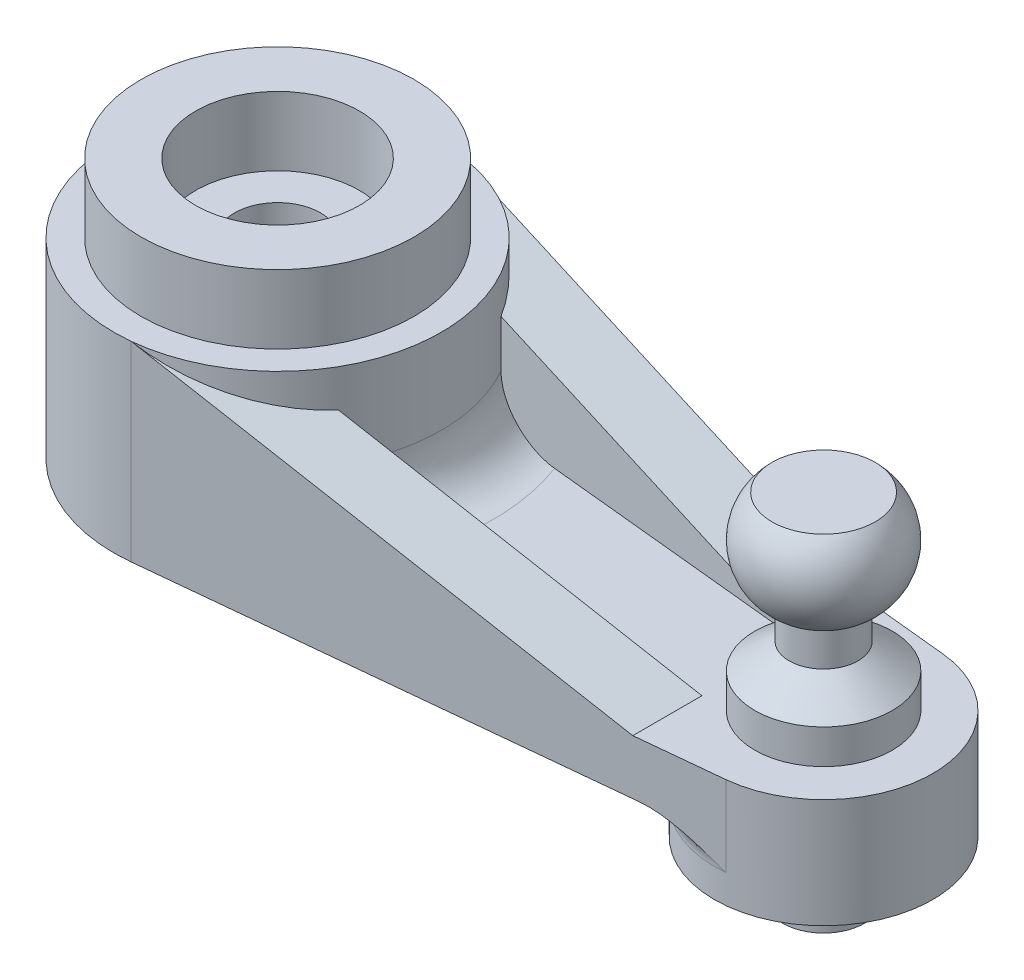
ISO-10303-21;
HEADER;
FILE_DESCRIPTION(('STEP AP214'),'2;1');
FILE_NAME('part.step','',(''),(''),'','','');
FILE_SCHEMA(('AUTOMOTIVE_DESIGN { 1 0 10303 214 1 1 1 1 }'));
ENDSEC;
DATA;
#1=APPLICATION_CONTEXT('core data for automotive mechanical design processes');
#2=APPLICATION_PROTOCOL_DEFINITION('international standard','automotive_design',2000,#1);
#3=PRODUCT_CONTEXT('',#1,'mechanical');
#4=PRODUCT('Part','Part','',(#3));
#5=PRODUCT_RELATED_PRODUCT_CATEGORY('part','',(#4));
#6=PRODUCT_DEFINITION_FORMATION('','',#4);
#7=PRODUCT_DEFINITION_CONTEXT('part definition',#1,'design');
#8=PRODUCT_DEFINITION('design','',#6,#7);
#9=PRODUCT_DEFINITION_SHAPE('','',#8);
#10=(LENGTH_UNIT() NAMED_UNIT(*) SI_UNIT(.MILLI.,.METRE.));
#11=(NAMED_UNIT(*) PLANE_ANGLE_UNIT() SI_UNIT($,.RADIAN.));
#12=(NAMED_UNIT(*) SI_UNIT($,.STERADIAN.) SOLID_ANGLE_UNIT());
#13=UNCERTAINTY_MEASURE_WITH_UNIT(LENGTH_MEASURE(1.E-05),#10,'distance_accuracy_value','');
#14=(GEOMETRIC_REPRESENTATION_CONTEXT(3) GLOBAL_UNCERTAINTY_ASSIGNED_CONTEXT((#13)) GLOBAL_UNIT_ASSIGNED_CONTEXT((#10,
#11,#12)) REPRESENTATION_CONTEXT('',''));
#15=CARTESIAN_POINT('',(0.,0.,0.));
#16=DIRECTION('',(0.,0.,1.));
#17=DIRECTION('',(1.,0.,0.));
#18=AXIS2_PLACEMENT_3D('',#15,#16,#17);
#19=CARTESIAN_POINT('',(1.56570147232496,5.23010843007844,-4.7625));
#20=DIRECTION('',(-0.286788069038324,-0.957994051890339,0.));
#21=DIRECTION('',(0.957994051890339,-0.286788069038324,0.));
#22=AXIS2_PLACEMENT_3D('',#19,#20,#21);
#23=PLANE('',#22);
#24=DIRECTION('',(-0.953584276240566,0.285467944930043,-0.0958388257658354));
#25=VECTOR('',#24,1.);
#26=CARTESIAN_POINT('',(1.36981146054647,5.28875067123953,-2.63874573289111));
#27=LINE('',#26,#25);
#28=CARTESIAN_POINT('',(13.7335619453296,1.5875,-1.39614205532746));
#29=VERTEX_POINT('',#28);
#30=CARTESIAN_POINT('',(4.13623704661039,4.46058493221435,-2.36070950018162));
#31=VERTEX_POINT('',#30);
#32=EDGE_CURVE('E127',#29,#31,#27,.T.);
#33=ORIENTED_EDGE('',*,*,#32,.F.);
#34=DIRECTION('',(0.,0.,1.));
#35=VECTOR('',#34,1.);
#36=CARTESIAN_POINT('',(13.7335619453296,1.5875,-4.7625));
#37=LINE('',#36,#35);
#38=CARTESIAN_POINT('',(13.7335619453296,1.5875,-3.40621768584589));
#39=VERTEX_POINT('',#38);
#40=EDGE_CURVE('E143',#39,#29,#37,.T.);
#41=ORIENTED_EDGE('',*,*,#40,.F.);
#42=DIRECTION('',(0.953584276240566,-0.285467944930043,0.0958388257658355));
#43=VECTOR('',#42,1.);
#44=CARTESIAN_POINT('',(0.47625,5.55625,-4.73862766922028));
#45=LINE('',#44,#43);
#46=CARTESIAN_POINT('',(0.47625,5.55625,-4.73862766922028));
#47=VERTEX_POINT('',#46);
#48=EDGE_CURVE('E147',#47,#39,#45,.T.);
#49=ORIENTED_EDGE('',*,*,#48,.F.);
#50=CARTESIAN_POINT('',(0.,5.69882167631677,0.));
#51=DIRECTION('',(-0.286788069038324,-0.957994051890339,0.));
#52=DIRECTION('',(-0.957994051890339,0.286788069038324,0.));
#53=AXIS2_PLACEMENT_3D('',#50,#51,#52);
#54=ELLIPSE('',#53,4.97132522963218,4.7625);
#55=EDGE_CURVE('E185',#47,#31,#54,.T.);
#56=ORIENTED_EDGE('',*,*,#55,.T.);
#57=EDGE_LOOP('',(#33,#41,#49,#56));
#58=FACE_BOUND('',#57,.T.);
#59=ADVANCED_FACE('F39',(#58),#23,.F.);
#60=CARTESIAN_POINT('',(0.,5.55625,0.));
#61=DIRECTION('',(0.,-1.,0.));
#62=DIRECTION('',(0.,0.,-1.));
#63=AXIS2_PLACEMENT_3D('',#60,#61,#62);
#64=CYLINDRICAL_SURFACE('',#63,4.7625);
#65=CARTESIAN_POINT('',(0.,0.,0.));
#66=DIRECTION('',(0.,1.,0.));
#67=DIRECTION('',(0.,0.,1.));
#68=AXIS2_PLACEMENT_3D('',#65,#66,#67);
#69=CIRCLE('',#68,4.7625);
#70=CARTESIAN_POINT('',(0.47625,0.,-4.73862766922028));
#71=VERTEX_POINT('',#70);
#72=CARTESIAN_POINT('',(0.476250000000001,0.,4.73862766922028));
#73=VERTEX_POINT('',#72);
#74=EDGE_CURVE('E160',#71,#73,#69,.T.);
#75=ORIENTED_EDGE('',*,*,#74,.T.);
#76=DIRECTION('',(0.,-1.,0.));
#77=VECTOR('',#76,1.);
#78=CARTESIAN_POINT('',(0.476250000000001,5.55625,4.73862766922028));
#79=LINE('',#78,#77);
#80=CARTESIAN_POINT('',(0.476249999999999,5.55625,4.73862766922028));
#81=VERTEX_POINT('',#80);
#82=EDGE_CURVE('E178',#81,#73,#79,.T.);
#83=ORIENTED_EDGE('',*,*,#82,.F.);
#84=CARTESIAN_POINT('',(0.,5.55625,0.));
#85=DIRECTION('',(0.,1.,0.));
#86=DIRECTION('',(0.,0.,1.));
#87=AXIS2_PLACEMENT_3D('',#84,#85,#86);
#88=CIRCLE('',#87,4.7625);
#89=EDGE_CURVE('E161',#47,#81,#88,.T.);
#90=ORIENTED_EDGE('',*,*,#89,.F.);
#91=DIRECTION('',(0.,-1.,0.));
#92=VECTOR('',#91,1.);
#93=CARTESIAN_POINT('',(0.47625,5.55625,-4.73862766922028));
#94=LINE('',#93,#92);
#95=EDGE_CURVE('E164',#47,#71,#94,.T.);
#96=ORIENTED_EDGE('',*,*,#95,.T.);
#97=EDGE_LOOP('',(#75,#83,#90,#96));
#98=FACE_BOUND('',#97,.T.);
#99=ADVANCED_FACE('F226',(#98),#64,.T.);
#100=CARTESIAN_POINT('',(0.47625,5.55625,4.73862766922028));
#101=DIRECTION('',(-0.1,0.,-0.99498743710662));
#102=DIRECTION('',(-0.99498743710662,0.,0.1));
#103=AXIS2_PLACEMENT_3D('',#100,#101,#102);
#104=PLANE('',#103);
#105=DIRECTION('',(0.,-1.,0.));
#106=VECTOR('',#105,1.);
#107=CARTESIAN_POINT('',(16.1925,5.55625,3.15908511281352));
#108=LINE('',#107,#106);
#109=CARTESIAN_POINT('',(16.1925,1.5875,3.15908511281352));
#110=VERTEX_POINT('',#109);
#111=CARTESIAN_POINT('',(16.1925,-0.75,3.15908511281352));
#112=VERTEX_POINT('',#111);
#113=EDGE_CURVE('E176',#110,#112,#108,.T.);
#114=ORIENTED_EDGE('',*,*,#113,.F.);
#115=DIRECTION('',(-0.99498743710662,0.,0.1));
#116=VECTOR('',#115,1.);
#117=CARTESIAN_POINT('',(0.47625,1.5875,4.73862766922028));
#118=LINE('',#117,#116);
#119=CARTESIAN_POINT('',(13.7335619453296,1.5875,3.40621768584588));
#120=VERTEX_POINT('',#119);
#121=EDGE_CURVE('E158',#110,#120,#118,.T.);
#122=ORIENTED_EDGE('',*,*,#121,.T.);
#123=DIRECTION('',(-0.953584276240566,0.285467944930043,0.0958388257658356));
#124=VECTOR('',#123,1.);
#125=CARTESIAN_POINT('',(0.47625,5.55625,4.73862766922028));
#126=LINE('',#125,#124);
#127=EDGE_CURVE('E141',#120,#81,#126,.T.);
#128=ORIENTED_EDGE('',*,*,#127,.T.);
#129=ORIENTED_EDGE('',*,*,#82,.T.);
#130=DIRECTION('',(0.99498743710662,0.,-0.1));
#131=VECTOR('',#130,1.);
#132=CARTESIAN_POINT('',(0.47625,0.,4.73862766922028));
#133=LINE('',#132,#131);
#134=CARTESIAN_POINT('',(13.8964708190008,0.,3.3898447279978));
#135=VERTEX_POINT('',#134);
#136=EDGE_CURVE('E168',#73,#135,#133,.T.);
#137=ORIENTED_EDGE('',*,*,#136,.T.);
#138=CARTESIAN_POINT('',(13.8964708190008,0.,3.38984472799781));
#139=CARTESIAN_POINT('',(13.9375612790772,-3.94246342919245E-06,3.38571498137548));
#140=CARTESIAN_POINT('',(13.9786355181918,-0.00117843439605369,3.38158686502116));
#141=CARTESIAN_POINT('',(14.06064768221,-0.00564932245312722,3.37334433240622));
#142=CARTESIAN_POINT('',(14.1015856718321,-0.00894450004539813,3.36922990964113));
#143=CARTESIAN_POINT('',(14.2238604204602,-0.0216588612066211,3.35694083501886));
#144=CARTESIAN_POINT('',(14.3049103008642,-0.033909604156082,3.34879501554605));
#145=CARTESIAN_POINT('',(14.4648125016523,-0.0643380609874803,3.33272423969252));
#146=CARTESIAN_POINT('',(14.5436796096108,-0.0824403947750877,3.32479779710467));
#147=CARTESIAN_POINT('',(14.7002091092547,-0.123492221473624,3.3090659904701));
#148=CARTESIAN_POINT('',(14.7778704104938,-0.146445855394132,3.30126073601735));
#149=CARTESIAN_POINT('',(14.9694386881453,-0.20833819157437,3.28200739969297));
#150=CARTESIAN_POINT('',(15.0825897955947,-0.249619564983325,3.27063528551045));
#151=CARTESIAN_POINT('',(15.3065260020936,-0.338110614607334,3.24812884993675));
#152=CARTESIAN_POINT('',(15.417310925066,-0.385320730217228,3.23699454624197));
#153=CARTESIAN_POINT('',(15.74794092754,-0.532924312454419,3.20376498070739));
#154=CARTESIAN_POINT('',(15.9652316447195,-0.638986598261524,3.18192644194034));
#155=CARTESIAN_POINT('',(16.1857767480147,-0.746715882989358,3.1597608250622));
#156=CARTESIAN_POINT('',(16.1891383807568,-0.748357952442116,3.15942296825951));
#157=CARTESIAN_POINT('',(16.1925,-0.75,3.15908511281352));
#158=B_SPLINE_CURVE_WITH_KNOTS('',3,(#138,#139,#140,#141,#142,#143,#144,#145,#146,#147,#148,
#149,#150,#151,#152,#153,#154,#155,#156,#157),.UNSPECIFIED.,.F.,.F.,(4,2,2,2,2,2,2,2,2,4),(0.,
0.123850203641415,0.247629307221144,0.494429882293765,0.738170051786999,0.982119121254398,
1.34480112618795,1.70751002632931,2.43558313806341,2.4468525657335),.UNSPECIFIED.);
#159=EDGE_CURVE('E202',#135,#112,#158,.T.);
#160=ORIENTED_EDGE('',*,*,#159,.T.);
#161=EDGE_LOOP('',(#114,#122,#128,#129,#137,#160));
#162=FACE_BOUND('',#161,.T.);
#163=ADVANCED_FACE('F222',(#162),#104,.F.);
#164=CARTESIAN_POINT('',(15.875,5.55625,0.));
#165=DIRECTION('',(0.,-1.,0.));
#166=DIRECTION('',(0.,0.,-1.));
#167=AXIS2_PLACEMENT_3D('',#164,#165,#166);
#168=CYLINDRICAL_SURFACE('',#167,3.175);
#169=CARTESIAN_POINT('',(15.875,-0.75,0.));
#170=DIRECTION('',(0.,1.,0.));
#171=DIRECTION('',(0.,0.,1.));
#172=AXIS2_PLACEMENT_3D('',#169,#170,#171);
#173=CIRCLE('',#172,3.175);
#174=CARTESIAN_POINT('',(16.1925,-0.75,-3.15908511281352));
#175=VERTEX_POINT('',#174);
#176=EDGE_CURVE('E191',#112,#175,#173,.F.);
#177=ORIENTED_EDGE('',*,*,#176,.T.);
#178=DIRECTION('',(0.,-1.,0.));
#179=VECTOR('',#178,1.);
#180=CARTESIAN_POINT('',(16.1925,5.55625,-3.15908511281352));
#181=LINE('',#180,#179);
#182=CARTESIAN_POINT('',(16.1925,1.5875,-3.15908511281352));
#183=VERTEX_POINT('',#182);
#184=EDGE_CURVE('E174',#183,#175,#181,.T.);
#185=ORIENTED_EDGE('',*,*,#184,.F.);
#186=CARTESIAN_POINT('',(15.875,1.5875,0.));
#187=DIRECTION('',(0.,-1.,0.));
#188=DIRECTION('',(1.,0.,0.));
#189=AXIS2_PLACEMENT_3D('',#186,#187,#188);
#190=CIRCLE('',#189,3.175);
#191=EDGE_CURVE('E155',#183,#110,#190,.T.);
#192=ORIENTED_EDGE('',*,*,#191,.T.);
#193=ORIENTED_EDGE('',*,*,#113,.T.);
#194=EDGE_LOOP('',(#177,#185,#192,#193));
#195=FACE_BOUND('',#194,.T.);
#196=CARTESIAN_POINT('',(15.875,-1.5875,0.));
#197=DIRECTION('',(0.,-1.,0.));
#198=DIRECTION('',(0.,0.,-1.));
#199=AXIS2_PLACEMENT_3D('',#196,#197,#198);
#200=CIRCLE('',#199,3.175);
#201=CARTESIAN_POINT('',(15.875,-1.5875,-3.175));
#202=VERTEX_POINT('',#201);
#203=EDGE_CURVE('E315',#202,#202,#200,.T.);
#204=ORIENTED_EDGE('',*,*,#203,.F.);
#205=EDGE_LOOP('',(#204));
#206=FACE_BOUND('',#205,.T.);
#207=ADVANCED_FACE('F217',(#195,#206),#168,.T.);
#208=CARTESIAN_POINT('',(0.47625,5.55625,-4.73862766922028));
#209=DIRECTION('',(-0.1,0.,0.99498743710662));
#210=DIRECTION('',(0.99498743710662,0.,0.1));
#211=AXIS2_PLACEMENT_3D('',#208,#209,#210);
#212=PLANE('',#211);
#213=ORIENTED_EDGE('',*,*,#48,.T.);
#214=DIRECTION('',(0.99498743710662,0.,0.1));
#215=VECTOR('',#214,1.);
#216=CARTESIAN_POINT('',(0.476249999999999,1.5875,-4.73862766922028));
#217=LINE('',#216,#215);
#218=EDGE_CURVE('E181',#39,#183,#217,.T.);
#219=ORIENTED_EDGE('',*,*,#218,.T.);
#220=ORIENTED_EDGE('',*,*,#184,.T.);
#221=CARTESIAN_POINT('',(13.8964708190008,0.,-3.38984472799781));
#222=CARTESIAN_POINT('',(13.9375612790772,-3.94246342919346E-06,-3.38571498137548));
#223=CARTESIAN_POINT('',(13.9786355181919,-0.00117843439605533,-3.38158686502116));
#224=CARTESIAN_POINT('',(14.0606476822101,-0.00564932245313488,-3.3733443324062));
#225=CARTESIAN_POINT('',(14.1015856718322,-0.00894450004541014,-3.36922990964111));
#226=CARTESIAN_POINT('',(14.2238604204605,-0.0216588612066482,-3.35694083501884));
#227=CARTESIAN_POINT('',(14.3049103008644,-0.0339096041561221,-3.34879501554602));
#228=CARTESIAN_POINT('',(14.4648125016526,-0.0643380609875347,-3.33272423969249));
#229=CARTESIAN_POINT('',(14.543679609611,-0.082440394775136,-3.32479779710466));
#230=CARTESIAN_POINT('',(14.7002091092548,-0.123492221473648,-3.3090659904701));
#231=CARTESIAN_POINT('',(14.7778704104939,-0.146445855394138,-3.30126073601734));
#232=CARTESIAN_POINT('',(14.9694386881452,-0.208338191574376,-3.28200739969297));
#233=CARTESIAN_POINT('',(15.0825897955947,-0.249619564983366,-3.27063528551046));
#234=CARTESIAN_POINT('',(15.3065260020936,-0.338110614607269,-3.24812884993675));
#235=CARTESIAN_POINT('',(15.417310925066,-0.385320730217023,-3.23699454624197));
#236=CARTESIAN_POINT('',(15.7479409275398,-0.532924312454753,-3.20376498070741));
#237=CARTESIAN_POINT('',(15.9652316447185,-0.638986598263485,-3.18192644194042));
#238=CARTESIAN_POINT('',(16.1857767480146,-0.746715882989417,-3.1597608250622));
#239=CARTESIAN_POINT('',(16.1891383807568,-0.748357952442146,-3.15942296825951));
#240=CARTESIAN_POINT('',(16.1925,-0.75,-3.15908511281352));
#241=B_SPLINE_CURVE_WITH_KNOTS('',3,(#221,#222,#223,#224,#225,#226,#227,#228,#229,#230,#231,
#232,#233,#234,#235,#236,#237,#238,#239,#240),.UNSPECIFIED.,.F.,.F.,(4,2,2,2,2,2,2,2,2,4),(0.,
0.123850203641501,0.247629307221314,0.494429882294068,0.738170051787138,0.982119121254391,
1.34480112618792,1.70751002632922,2.4355831380634,2.4468525657335),.UNSPECIFIED.);
#242=CARTESIAN_POINT('',(13.8964708190008,0.,-3.3898447279978));
#243=VERTEX_POINT('',#242);
#244=EDGE_CURVE('E196',#175,#243,#241,.F.);
#245=ORIENTED_EDGE('',*,*,#244,.T.);
#246=DIRECTION('',(-0.99498743710662,0.,-0.1));
#247=VECTOR('',#246,1.);
#248=CARTESIAN_POINT('',(0.47625,0.,-4.73862766922028));
#249=LINE('',#248,#247);
#250=EDGE_CURVE('E165',#243,#71,#249,.T.);
#251=ORIENTED_EDGE('',*,*,#250,.T.);
#252=ORIENTED_EDGE('',*,*,#95,.F.);
#253=EDGE_LOOP('',(#213,#219,#220,#245,#251,#252));
#254=FACE_BOUND('',#253,.T.);
#255=ADVANCED_FACE('F211',(#254),#212,.F.);
#256=CARTESIAN_POINT('',(0.,5.55625,0.));
#257=DIRECTION('',(0.,1.,0.));
#258=DIRECTION('',(0.,0.,1.));
#259=AXIS2_PLACEMENT_3D('',#256,#257,#258);
#260=PLANE('',#259);
#261=CARTESIAN_POINT('',(0.,5.55625,0.));
#262=DIRECTION('',(0.,1.,0.));
#263=DIRECTION('',(0.,0.,1.));
#264=AXIS2_PLACEMENT_3D('',#261,#262,#263);
#265=CIRCLE('',#264,3.96875);
#266=CARTESIAN_POINT('',(0.,5.55625,3.96875));
#267=VERTEX_POINT('',#266);
#268=EDGE_CURVE('E329',#267,#267,#265,.T.);
#269=ORIENTED_EDGE('',*,*,#268,.F.);
#270=EDGE_LOOP('',(#269));
#271=FACE_BOUND('',#270,.T.);
#272=ORIENTED_EDGE('',*,*,#89,.T.);
#273=CARTESIAN_POINT('',(0.,5.55625,0.));
#274=DIRECTION('',(0.,1.,0.));
#275=DIRECTION('',(0.,0.,1.));
#276=AXIS2_PLACEMENT_3D('',#273,#274,#275);
#277=CIRCLE('',#276,4.7625);
#278=EDGE_CURVE('E144',#81,#47,#277,.T.);
#279=ORIENTED_EDGE('',*,*,#278,.T.);
#280=EDGE_LOOP('',(#272,#279));
#281=FACE_BOUND('',#280,.T.);
#282=ADVANCED_FACE('F216',(#271,#281),#260,.T.);
#283=CARTESIAN_POINT('',(0.,0.,0.));
#284=DIRECTION('',(0.,1.,0.));
#285=DIRECTION('',(0.,0.,1.));
#286=AXIS2_PLACEMENT_3D('',#283,#284,#285);
#287=PLANE('',#286);
#288=ORIENTED_EDGE('',*,*,#250,.F.);
#289=CARTESIAN_POINT('',(15.875,0.,0.));
#290=DIRECTION('',(0.,1.,0.));
#291=DIRECTION('',(0.,0.,1.));
#292=AXIS2_PLACEMENT_3D('',#289,#290,#291);
#293=CIRCLE('',#292,3.925);
#294=EDGE_CURVE('E194',#243,#135,#293,.T.);
#295=ORIENTED_EDGE('',*,*,#294,.T.);
#296=ORIENTED_EDGE('',*,*,#136,.F.);
#297=ORIENTED_EDGE('',*,*,#74,.F.);
#298=EDGE_LOOP('',(#288,#295,#296,#297));
#299=FACE_BOUND('',#298,.T.);
#300=CARTESIAN_POINT('',(0.,0.,0.));
#301=DIRECTION('',(0.,-1.,0.));
#302=DIRECTION('',(0.,0.,-1.));
#303=AXIS2_PLACEMENT_3D('',#300,#301,#302);
#304=CIRCLE('',#303,3.571875);
#305=CARTESIAN_POINT('',(0.,0.,-3.571875));
#306=VERTEX_POINT('',#305);
#307=EDGE_CURVE('E309',#306,#306,#304,.T.);
#308=ORIENTED_EDGE('',*,*,#307,.F.);
#309=EDGE_LOOP('',(#308));
#310=FACE_BOUND('',#309,.T.);
#311=ADVANCED_FACE('F219',(#299,#310),#287,.F.);
#312=CARTESIAN_POINT('',(0.,1.5875,-4.7625));
#313=DIRECTION('',(0.,-1.,0.));
#314=DIRECTION('',(1.,0.,0.));
#315=AXIS2_PLACEMENT_3D('',#312,#313,#314);
#316=PLANE('',#315);
#317=CARTESIAN_POINT('',(15.875,1.5875,0.));
#318=DIRECTION('',(0.,-1.,0.));
#319=DIRECTION('',(1.,0.,0.));
#320=AXIS2_PLACEMENT_3D('',#317,#318,#319);
#321=CIRCLE('',#320,2.);
#322=CARTESIAN_POINT('',(17.875,1.5875,0.));
#323=VERTEX_POINT('',#322);
#324=EDGE_CURVE('E258',#323,#323,#321,.F.);
#325=ORIENTED_EDGE('',*,*,#324,.F.);
#326=EDGE_LOOP('',(#325));
#327=FACE_BOUND('',#326,.T.);
#328=DIRECTION('',(-0.99498743710662,0.,-0.0999999999999999));
#329=VECTOR('',#328,1.);
#330=CARTESIAN_POINT('',(0.27625,1.5875,-2.74865279500704));
#331=LINE('',#330,#329);
#332=CARTESIAN_POINT('',(5.86835380804935,1.5875,-2.18662521561257));
#333=VERTEX_POINT('',#332);
#334=EDGE_CURVE('E321',#29,#333,#331,.T.);
#335=ORIENTED_EDGE('',*,*,#334,.T.);
#336=CARTESIAN_POINT('',(0.,1.5875,0.));
#337=DIRECTION('',(0.,-1.,0.));
#338=DIRECTION('',(1.,0.,0.));
#339=AXIS2_PLACEMENT_3D('',#336,#337,#338);
#340=CIRCLE('',#339,6.2625);
#341=CARTESIAN_POINT('',(5.86835380804935,1.5875,2.18662521561257));
#342=VERTEX_POINT('',#341);
#343=EDGE_CURVE('E136',#333,#342,#340,.T.);
#344=ORIENTED_EDGE('',*,*,#343,.T.);
#345=DIRECTION('',(-0.99498743710662,0.,0.0999999999999999));
#346=VECTOR('',#345,1.);
#347=CARTESIAN_POINT('',(0.27625,1.5875,2.74865279500704));
#348=LINE('',#347,#346);
#349=CARTESIAN_POINT('',(13.7335619453296,1.5875,1.39614205532746));
#350=VERTEX_POINT('',#349);
#351=EDGE_CURVE('E121',#350,#342,#348,.T.);
#352=ORIENTED_EDGE('',*,*,#351,.F.);
#353=EDGE_CURVE('E133',#350,#120,#37,.T.);
#354=ORIENTED_EDGE('',*,*,#353,.T.);
#355=ORIENTED_EDGE('',*,*,#121,.F.);
#356=ORIENTED_EDGE('',*,*,#191,.F.);
#357=ORIENTED_EDGE('',*,*,#218,.F.);
#358=ORIENTED_EDGE('',*,*,#40,.T.);
#359=EDGE_LOOP('',(#335,#344,#352,#354,#355,#356,#357,#358));
#360=FACE_BOUND('',#359,.T.);
#361=ADVANCED_FACE('F132',(#327,#360),#316,.F.);
#362=ORIENTED_EDGE('',*,*,#353,.F.);
#363=DIRECTION('',(-0.953584276240566,0.285467944930043,0.0958388257658355));
#364=VECTOR('',#363,1.);
#365=CARTESIAN_POINT('',(2.24030499486383,5.02815702838276,2.55125784089835));
#366=LINE('',#365,#364);
#367=CARTESIAN_POINT('',(4.13623704661039,4.46058493221435,2.36070950018162));
#368=VERTEX_POINT('',#367);
#369=EDGE_CURVE('E118',#350,#368,#366,.T.);
#370=ORIENTED_EDGE('',*,*,#369,.T.);
#371=EDGE_CURVE('E184',#368,#81,#54,.T.);
#372=ORIENTED_EDGE('',*,*,#371,.T.);
#373=ORIENTED_EDGE('',*,*,#127,.F.);
#374=EDGE_LOOP('',(#362,#370,#372,#373));
#375=FACE_BOUND('',#374,.T.);
#376=ADVANCED_FACE('F139',(#375),#23,.F.);
#377=CARTESIAN_POINT('',(0.,-13.4703841816037,0.));
#378=DIRECTION('',(0.,1.,0.));
#379=DIRECTION('',(0.,0.,1.));
#380=AXIS2_PLACEMENT_3D('',#377,#378,#379);
#381=CYLINDRICAL_SURFACE('',#380,4.7625);
#382=DIRECTION('',(0.,-1.,0.));
#383=VECTOR('',#382,1.);
#384=CARTESIAN_POINT('',(4.13623704661039,16.2520642555192,2.36070950018162));
#385=LINE('',#384,#383);
#386=CARTESIAN_POINT('',(4.13623704661039,3.0875,2.36070950018162));
#387=VERTEX_POINT('',#386);
#388=EDGE_CURVE('E122',#368,#387,#385,.T.);
#389=ORIENTED_EDGE('',*,*,#388,.T.);
#390=CARTESIAN_POINT('',(0.,3.08749999999999,0.));
#391=DIRECTION('',(0.,-1.,0.));
#392=DIRECTION('',(1.,0.,0.));
#393=AXIS2_PLACEMENT_3D('',#390,#391,#392);
#394=CIRCLE('',#393,4.7625);
#395=CARTESIAN_POINT('',(4.13623704661039,3.0875,-2.36070950018162));
#396=VERTEX_POINT('',#395);
#397=EDGE_CURVE('E52',#387,#396,#394,.F.);
#398=ORIENTED_EDGE('',*,*,#397,.T.);
#399=DIRECTION('',(0.,-1.,0.));
#400=VECTOR('',#399,1.);
#401=CARTESIAN_POINT('',(4.13623704661039,16.2520642555192,-2.36070950018162));
#402=LINE('',#401,#400);
#403=EDGE_CURVE('E323',#31,#396,#402,.T.);
#404=ORIENTED_EDGE('',*,*,#403,.F.);
#405=ORIENTED_EDGE('',*,*,#55,.F.);
#406=ORIENTED_EDGE('',*,*,#278,.F.);
#407=ORIENTED_EDGE('',*,*,#371,.F.);
#408=EDGE_LOOP('',(#389,#398,#404,#405,#406,#407));
#409=FACE_BOUND('',#408,.T.);
#410=ADVANCED_FACE('F248',(#409),#381,.T.);
#411=CARTESIAN_POINT('',(0.,7.55625,0.));
#412=DIRECTION('',(0.,1.,0.));
#413=DIRECTION('',(0.,0.,1.));
#414=AXIS2_PLACEMENT_3D('',#411,#412,#413);
#415=PLANE('',#414);
#416=CARTESIAN_POINT('',(0.,7.55625,0.));
#417=DIRECTION('',(0.,1.,0.));
#418=DIRECTION('',(0.,0.,1.));
#419=AXIS2_PLACEMENT_3D('',#416,#417,#418);
#420=CIRCLE('',#419,3.96875);
#421=CARTESIAN_POINT('',(0.,7.55625,3.96875));
#422=VERTEX_POINT('',#421);
#423=EDGE_CURVE('E148',#422,#422,#420,.T.);
#424=ORIENTED_EDGE('',*,*,#423,.T.);
#425=EDGE_LOOP('',(#424));
#426=FACE_BOUND('',#425,.T.);
#427=CARTESIAN_POINT('',(0.,7.55625,0.));
#428=DIRECTION('',(0.,1.,0.));
#429=DIRECTION('',(0.,0.,1.));
#430=AXIS2_PLACEMENT_3D('',#427,#428,#429);
#431=CIRCLE('',#430,2.38125);
#432=CARTESIAN_POINT('',(0.,7.55625,2.38125));
#433=VERTEX_POINT('',#432);
#434=EDGE_CURVE('E126',#433,#433,#431,.T.);
#435=ORIENTED_EDGE('',*,*,#434,.F.);
#436=EDGE_LOOP('',(#435));
#437=FACE_BOUND('',#436,.T.);
#438=ADVANCED_FACE('F280',(#426,#437),#415,.T.);
#439=CARTESIAN_POINT('',(0.,7.55625,0.));
#440=DIRECTION('',(0.,-1.,0.));
#441=DIRECTION('',(0.,0.,-1.));
#442=AXIS2_PLACEMENT_3D('',#439,#440,#441);
#443=CYLINDRICAL_SURFACE('',#442,3.96875);
#444=ORIENTED_EDGE('',*,*,#423,.F.);
#445=EDGE_LOOP('',(#444));
#446=FACE_BOUND('',#445,.T.);
#447=ORIENTED_EDGE('',*,*,#268,.T.);
#448=EDGE_LOOP('',(#447));
#449=FACE_BOUND('',#448,.T.);
#450=ADVANCED_FACE('F278',(#446,#449),#443,.T.);
#451=CARTESIAN_POINT('',(0.,7.55625,0.));
#452=DIRECTION('',(0.,-1.,0.));
#453=DIRECTION('',(0.,0.,-1.));
#454=AXIS2_PLACEMENT_3D('',#451,#452,#453);
#455=CYLINDRICAL_SURFACE('',#454,2.38125);
#456=ORIENTED_EDGE('',*,*,#434,.T.);
#457=EDGE_LOOP('',(#456));
#458=FACE_BOUND('',#457,.T.);
#459=CARTESIAN_POINT('',(0.,5.55625,0.));
#460=DIRECTION('',(0.,1.,0.));
#461=DIRECTION('',(0.,0.,1.));
#462=AXIS2_PLACEMENT_3D('',#459,#460,#461);
#463=CIRCLE('',#462,2.38125);
#464=CARTESIAN_POINT('',(0.,5.55625,2.38125));
#465=VERTEX_POINT('',#464);
#466=EDGE_CURVE('E188',#465,#465,#463,.F.);
#467=ORIENTED_EDGE('',*,*,#466,.T.);
#468=EDGE_LOOP('',(#467));
#469=FACE_BOUND('',#468,.T.);
#470=ADVANCED_FACE('F275',(#458,#469),#455,.F.);
#471=CARTESIAN_POINT('',(0.,5.55625,0.));
#472=DIRECTION('',(0.,1.,0.));
#473=DIRECTION('',(0.,0.,1.));
#474=AXIS2_PLACEMENT_3D('',#471,#472,#473);
#475=CIRCLE('',#474,1.25);
#476=CARTESIAN_POINT('',(0.,5.55625,1.25));
#477=VERTEX_POINT('',#476);
#478=EDGE_CURVE('E305',#477,#477,#475,.T.);
#479=ORIENTED_EDGE('',*,*,#478,.F.);
#480=EDGE_LOOP('',(#479));
#481=FACE_BOUND('',#480,.T.);
#482=ORIENTED_EDGE('',*,*,#466,.F.);
#483=EDGE_LOOP('',(#482));
#484=FACE_BOUND('',#483,.T.);
#485=ADVANCED_FACE('F272',(#481,#484),#260,.T.);
#486=CARTESIAN_POINT('',(0.276250000000008,16.2520642555192,2.74865279500704));
#487=DIRECTION('',(0.0999999999999999,0.,0.99498743710662));
#488=DIRECTION('',(0.99498743710662,0.,-0.0999999999999999));
#489=AXIS2_PLACEMENT_3D('',#486,#487,#488);
#490=PLANE('',#489);
#491=ORIENTED_EDGE('',*,*,#351,.T.);
#492=CARTESIAN_POINT('',(5.86835380804935,1.5875,2.18662521561257));
#493=CARTESIAN_POINT('',(5.76187446784726,1.58748402729302,2.19732679195727));
#494=CARTESIAN_POINT('',(5.65545997529333,1.59672310036434,2.2080218508681));
#495=CARTESIAN_POINT('',(5.44558752355058,1.6329293863019,2.22911482590636));
#496=CARTESIAN_POINT('',(5.34213132186754,1.65990691817698,2.23951256539782));
#497=CARTESIAN_POINT('',(5.14114530721666,1.73080201186519,2.25971241990405));
#498=CARTESIAN_POINT('',(5.04361477088233,1.77471750117434,2.26951460761991));
#499=CARTESIAN_POINT('',(4.85736901218123,1.87872282507908,2.28823301066253));
#500=CARTESIAN_POINT('',(4.76865833972368,1.9388209491498,2.29714876870622));
#501=CARTESIAN_POINT('',(4.60531469333262,2.07285302234192,2.31356542285676));
#502=CARTESIAN_POINT('',(4.53042250180112,2.14646562346056,2.32109237131243));
#503=CARTESIAN_POINT('',(4.39654524132879,2.30707493226599,2.33454754225024));
#504=CARTESIAN_POINT('',(4.33752417033963,2.394040632986,2.34047938307436));
#505=CARTESIAN_POINT('',(4.25476529568835,2.55090704412353,2.34879696293164));
#506=CARTESIAN_POINT('',(4.22575497746282,2.61802276100231,2.35171260961658));
#507=CARTESIAN_POINT('',(4.17932102571233,2.75612644340182,2.35637939735869));
#508=CARTESIAN_POINT('',(4.16187006007165,2.82710484203904,2.35813328539686));
#509=CARTESIAN_POINT('',(4.14593174387718,2.93017678736369,2.35973514644556));
#510=CARTESIAN_POINT('',(4.14230167665201,2.96153203872307,2.36009998192888));
#511=CARTESIAN_POINT('',(4.13745428400875,3.0244194131757,2.36058716322007));
#512=CARTESIAN_POINT('',(4.13623613733344,3.05595147239732,2.36070959156739));
#513=CARTESIAN_POINT('',(4.13623704661039,3.0875,2.36070950018162));
#514=B_SPLINE_CURVE_WITH_KNOTS('',3,(#492,#493,#494,#495,#496,#497,#498,#499,#500,#501,#502,
#503,#504,#505,#506,#507,#508,#509,#510,#511,#512,#513),.UNSPECIFIED.,.F.,.F.,(4,2,2,2,2,2,2,2,
2,2,4),(0.,0.32056689848771,0.64132044581501,0.962034758646523,1.28291366936769,
1.59697001407214,1.91030782594212,2.12895579049294,2.34708489819556,2.44170683278635,
2.5362965431315),.UNSPECIFIED.);
#515=EDGE_CURVE('E66',#342,#387,#514,.T.);
#516=ORIENTED_EDGE('',*,*,#515,.T.);
#517=ORIENTED_EDGE('',*,*,#388,.F.);
#518=ORIENTED_EDGE('',*,*,#369,.F.);
#519=EDGE_LOOP('',(#491,#516,#517,#518));
#520=FACE_BOUND('',#519,.T.);
#521=ADVANCED_FACE('F120',(#520),#490,.F.);
#522=CARTESIAN_POINT('',(0.276250000000007,16.2520642555192,-2.74865279500704));
#523=DIRECTION('',(-0.0999999999999999,0.,0.99498743710662));
#524=DIRECTION('',(0.99498743710662,0.,0.0999999999999999));
#525=AXIS2_PLACEMENT_3D('',#522,#523,#524);
#526=PLANE('',#525);
#527=ORIENTED_EDGE('',*,*,#403,.T.);
#528=CARTESIAN_POINT('',(4.13623704661039,3.0875,-2.36070950018162));
#529=CARTESIAN_POINT('',(4.13622634286768,3.05032718393926,-2.36071057594824));
#530=CARTESIAN_POINT('',(4.13792456946503,3.01316005847719,-2.36053989775332));
#531=CARTESIAN_POINT('',(4.14465658137334,2.93915343510496,-2.35986330509925));
#532=CARTESIAN_POINT('',(4.1496884050929,2.902313757426,-2.35935758778747));
#533=CARTESIAN_POINT('',(4.16296386024014,2.82946230784209,-2.35802335434369));
#534=CARTESIAN_POINT('',(4.17118721613387,2.79344679999488,-2.35719687597954));
#535=CARTESIAN_POINT('',(4.1906953362659,2.72227056607854,-2.35523623613581));
#536=CARTESIAN_POINT('',(4.20198041131013,2.68710992718524,-2.35410204341906));
#537=CARTESIAN_POINT('',(4.24011743415637,2.583408772085,-2.35026912840687));
#538=CARTESIAN_POINT('',(4.27129255526238,2.51642989935525,-2.34713591084619));
#539=CARTESIAN_POINT('',(4.34353413447619,2.38807543066508,-2.33987535895179));
#540=CARTESIAN_POINT('',(4.38461570444855,2.3267085948077,-2.33574650581855));
#541=CARTESIAN_POINT('',(4.47879321814377,2.20557944853245,-2.32628130955747));
#542=CARTESIAN_POINT('',(4.53260764176224,2.14638293241915,-2.32087275648318));
#543=CARTESIAN_POINT('',(4.64800495834027,2.03626354313264,-2.30927488978914));
#544=CARTESIAN_POINT('',(4.70959007428014,1.98534304707567,-2.30308535275147));
#545=CARTESIAN_POINT('',(4.85027999360207,1.88403424998239,-2.28894548383704));
#546=CARTESIAN_POINT('',(4.9305648692667,1.83529774432136,-2.28087655023341));
#547=CARTESIAN_POINT('',(5.0974803707225,1.75038643551551,-2.26410091114181));
#548=CARTESIAN_POINT('',(5.18411515771536,1.71421996046901,-2.25539378743733));
#549=CARTESIAN_POINT('',(5.36877466332727,1.65268020526021,-2.23683480882863));
#550=CARTESIAN_POINT('',(5.46715815644084,1.62838774880215,-2.22694689573098));
#551=CARTESIAN_POINT('',(5.66646578410302,1.59579203870284,-2.20691572546397));
#552=CARTESIAN_POINT('',(5.76738889181672,1.58748242474781,-2.1967725714954));
#553=CARTESIAN_POINT('',(5.86835380804935,1.5875,-2.18662521561257));
#554=B_SPLINE_CURVE_WITH_KNOTS('',3,(#528,#529,#530,#531,#532,#533,#534,#535,#536,#537,#538,
#539,#540,#541,#542,#543,#544,#545,#546,#547,#548,#549,#550,#551,#552,#553),.UNSPECIFIED.,.F.,
.F.,(4,2,2,2,2,2,2,2,2,2,2,2,4),(0.,0.111469948016376,0.222874361865726,0.333582321901697,
0.444301524501418,0.66507944810263,0.886196313549804,1.12585002690334,1.36557245466061,
1.64723613244438,1.92908606841992,2.23324390468874,2.53728067739499),.UNSPECIFIED.);
#555=EDGE_CURVE('E11',#396,#333,#554,.T.);
#556=ORIENTED_EDGE('',*,*,#555,.T.);
#557=ORIENTED_EDGE('',*,*,#334,.F.);
#558=ORIENTED_EDGE('',*,*,#32,.T.);
#559=EDGE_LOOP('',(#527,#556,#557,#558));
#560=FACE_BOUND('',#559,.T.);
#561=ADVANCED_FACE('F271',(#560),#526,.T.);
#562=CARTESIAN_POINT('',(0.,3.,0.));
#563=DIRECTION('',(0.,-1.,0.));
#564=DIRECTION('',(0.,0.,-1.));
#565=AXIS2_PLACEMENT_3D('',#562,#563,#564);
#566=CYLINDRICAL_SURFACE('',#565,3.571875);
#567=CARTESIAN_POINT('',(0.,3.,0.));
#568=DIRECTION('',(0.,-1.,0.));
#569=DIRECTION('',(0.,0.,-1.));
#570=AXIS2_PLACEMENT_3D('',#567,#568,#569);
#571=CIRCLE('',#570,3.571875);
#572=CARTESIAN_POINT('',(0.,3.,-3.571875));
#573=VERTEX_POINT('',#572);
#574=EDGE_CURVE('E137',#573,#573,#571,.T.);
#575=ORIENTED_EDGE('',*,*,#574,.F.);
#576=EDGE_LOOP('',(#575));
#577=FACE_BOUND('',#576,.T.);
#578=ORIENTED_EDGE('',*,*,#307,.T.);
#579=EDGE_LOOP('',(#578));
#580=FACE_BOUND('',#579,.T.);
#581=ADVANCED_FACE('F383',(#577,#580),#566,.F.);
#582=CARTESIAN_POINT('',(0.,3.,0.));
#583=DIRECTION('',(0.,-1.,0.));
#584=DIRECTION('',(0.,0.,-1.));
#585=AXIS2_PLACEMENT_3D('',#582,#583,#584);
#586=PLANE('',#585);
#587=CARTESIAN_POINT('',(0.,3.,0.));
#588=DIRECTION('',(0.,-1.,0.));
#589=DIRECTION('',(0.,0.,-1.));
#590=AXIS2_PLACEMENT_3D('',#587,#588,#589);
#591=CIRCLE('',#590,1.25);
#592=CARTESIAN_POINT('',(0.,3.,-1.25));
#593=VERTEX_POINT('',#592);
#594=EDGE_CURVE('E310',#593,#593,#591,.T.);
#595=ORIENTED_EDGE('',*,*,#594,.F.);
#596=EDGE_LOOP('',(#595));
#597=FACE_BOUND('',#596,.T.);
#598=ORIENTED_EDGE('',*,*,#574,.T.);
#599=EDGE_LOOP('',(#598));
#600=FACE_BOUND('',#599,.T.);
#601=ADVANCED_FACE('F381',(#597,#600),#586,.T.);
#602=CARTESIAN_POINT('',(0.,7.55625,0.));
#603=DIRECTION('',(0.,-1.,0.));
#604=DIRECTION('',(0.,0.,-1.));
#605=AXIS2_PLACEMENT_3D('',#602,#603,#604);
#606=CYLINDRICAL_SURFACE('',#605,1.25);
#607=ORIENTED_EDGE('',*,*,#478,.T.);
#608=EDGE_LOOP('',(#607));
#609=FACE_BOUND('',#608,.T.);
#610=ORIENTED_EDGE('',*,*,#594,.T.);
#611=EDGE_LOOP('',(#610));
#612=FACE_BOUND('',#611,.T.);
#613=ADVANCED_FACE('F377',(#609,#612),#606,.F.);
#614=CARTESIAN_POINT('',(15.875,-1.5875,0.));
#615=DIRECTION('',(0.,-1.,0.));
#616=DIRECTION('',(0.,0.,-1.));
#617=AXIS2_PLACEMENT_3D('',#614,#615,#616);
#618=PLANE('',#617);
#619=CARTESIAN_POINT('',(15.875,-1.5875,0.));
#620=DIRECTION('',(0.,1.,0.));
#621=DIRECTION('',(0.,0.,1.));
#622=AXIS2_PLACEMENT_3D('',#619,#620,#621);
#623=CIRCLE('',#622,1.190625);
#624=CARTESIAN_POINT('',(15.875,-1.5875,1.190625));
#625=VERTEX_POINT('',#624);
#626=EDGE_CURVE('E598',#625,#625,#623,.T.);
#627=ORIENTED_EDGE('',*,*,#626,.T.);
#628=EDGE_LOOP('',(#627));
#629=FACE_BOUND('',#628,.T.);
#630=ORIENTED_EDGE('',*,*,#203,.T.);
#631=EDGE_LOOP('',(#630));
#632=FACE_BOUND('',#631,.T.);
#633=ADVANCED_FACE('F374',(#629,#632),#618,.T.);
#634=CARTESIAN_POINT('',(15.875,-0.75,0.));
#635=DIRECTION('',(0.,1.,0.));
#636=DIRECTION('',(0.,0.,1.));
#637=AXIS2_PLACEMENT_3D('',#634,#635,#636);
#638=TOROIDAL_SURFACE('',#637,3.925,0.75);
#639=ORIENTED_EDGE('',*,*,#159,.F.);
#640=ORIENTED_EDGE('',*,*,#294,.F.);
#641=ORIENTED_EDGE('',*,*,#244,.F.);
#642=ORIENTED_EDGE('',*,*,#176,.F.);
#643=EDGE_LOOP('',(#639,#640,#641,#642));
#644=FACE_BOUND('',#643,.T.);
#645=ADVANCED_FACE('F208',(#644),#638,.F.);
#646=CARTESIAN_POINT('',(15.875,-3.175,0.));
#647=DIRECTION('',(0.,1.,0.));
#648=DIRECTION('',(0.,0.,1.));
#649=AXIS2_PLACEMENT_3D('',#646,#647,#648);
#650=PLANE('',#649);
#651=CARTESIAN_POINT('',(15.875,-3.175,0.));
#652=DIRECTION('',(0.,1.,0.));
#653=DIRECTION('',(0.,0.,1.));
#654=AXIS2_PLACEMENT_3D('',#651,#652,#653);
#655=CIRCLE('',#654,1.190625);
#656=CARTESIAN_POINT('',(15.875,-3.175,1.190625));
#657=VERTEX_POINT('',#656);
#658=EDGE_CURVE('E601',#657,#657,#655,.T.);
#659=ORIENTED_EDGE('',*,*,#658,.F.);
#660=EDGE_LOOP('',(#659));
#661=FACE_BOUND('',#660,.T.);
#662=ADVANCED_FACE('F369',(#661),#650,.F.);
#663=CARTESIAN_POINT('',(15.875,1.5875,0.));
#664=DIRECTION('',(0.,1.,0.));
#665=DIRECTION('',(0.,0.,1.));
#666=AXIS2_PLACEMENT_3D('',#663,#664,#665);
#667=CYLINDRICAL_SURFACE('',#666,1.190625);
#668=ORIENTED_EDGE('',*,*,#626,.F.);
#669=EDGE_LOOP('',(#668));
#670=FACE_BOUND('',#669,.T.);
#671=ORIENTED_EDGE('',*,*,#658,.T.);
#672=EDGE_LOOP('',(#671));
#673=FACE_BOUND('',#672,.T.);
#674=ADVANCED_FACE('F365',(#670,#673),#667,.T.);
#675=CARTESIAN_POINT('',(15.875,7.0875,0.));
#676=DIRECTION('',(0.,-1.,0.));
#677=DIRECTION('',(0.,0.,-1.));
#678=AXIS2_PLACEMENT_3D('',#675,#676,#677);
#679=PLANE('',#678);
#680=CARTESIAN_POINT('',(15.875,7.0875,0.));
#681=DIRECTION('',(0.,1.,0.));
#682=DIRECTION('',(0.,0.,1.));
#683=AXIS2_PLACEMENT_3D('',#680,#681,#682);
#684=CIRCLE('',#683,1.5);
#685=CARTESIAN_POINT('',(15.875,7.0875,1.5));
#686=VERTEX_POINT('',#685);
#687=EDGE_CURVE('E606',#686,#686,#684,.T.);
#688=ORIENTED_EDGE('',*,*,#687,.T.);
#689=EDGE_LOOP('',(#688));
#690=FACE_BOUND('',#689,.T.);
#691=ADVANCED_FACE('F361',(#690),#679,.F.);
#692=CARTESIAN_POINT('',(15.875,5.88465292478952,0.));
#693=DIRECTION('',(0.,1.,0.));
#694=DIRECTION('',(0.,0.,1.));
#695=AXIS2_PLACEMENT_3D('',#692,#693,#694);
#696=DEGENERATE_TOROIDAL_SURFACE('',#695,0.303158913657606,1.69684108634239,.T.);
#697=ORIENTED_EDGE('',*,*,#687,.F.);
#698=EDGE_LOOP('',(#697));
#699=FACE_BOUND('',#698,.T.);
#700=CARTESIAN_POINT('',(15.875,4.3375,0.));
#701=DIRECTION('',(0.,1.,0.));
#702=DIRECTION('',(0.,0.,1.));
#703=AXIS2_PLACEMENT_3D('',#700,#701,#702);
#704=CIRCLE('',#703,1.);
#705=CARTESIAN_POINT('',(15.875,4.3375,1.));
#706=VERTEX_POINT('',#705);
#707=EDGE_CURVE('E609',#706,#706,#704,.T.);
#708=ORIENTED_EDGE('',*,*,#707,.T.);
#709=EDGE_LOOP('',(#708));
#710=FACE_BOUND('',#709,.T.);
#711=ADVANCED_FACE('F357',(#699,#710),#696,.T.);
#712=CARTESIAN_POINT('',(15.875,1.5875,0.));
#713=DIRECTION('',(0.,1.,0.));
#714=DIRECTION('',(0.,0.,1.));
#715=AXIS2_PLACEMENT_3D('',#712,#713,#714);
#716=CYLINDRICAL_SURFACE('',#715,1.);
#717=ORIENTED_EDGE('',*,*,#707,.F.);
#718=EDGE_LOOP('',(#717));
#719=FACE_BOUND('',#718,.T.);
#720=CARTESIAN_POINT('',(15.875,3.3375,0.));
#721=DIRECTION('',(0.,1.,0.));
#722=DIRECTION('',(0.,0.,1.));
#723=AXIS2_PLACEMENT_3D('',#720,#721,#722);
#724=CIRCLE('',#723,1.);
#725=CARTESIAN_POINT('',(15.875,3.3375,1.));
#726=VERTEX_POINT('',#725);
#727=EDGE_CURVE('E612',#726,#726,#724,.T.);
#728=ORIENTED_EDGE('',*,*,#727,.T.);
#729=EDGE_LOOP('',(#728));
#730=FACE_BOUND('',#729,.T.);
#731=ADVANCED_FACE('F350',(#719,#730),#716,.T.);
#732=CARTESIAN_POINT('',(15.875,2.5875,0.));
#733=DIRECTION('',(0.,-1.,0.));
#734=DIRECTION('',(0.,0.,-1.));
#735=AXIS2_PLACEMENT_3D('',#732,#733,#734);
#736=CONICAL_SURFACE('',#735,2.,0.927295218001613);
#737=ORIENTED_EDGE('',*,*,#727,.F.);
#738=EDGE_LOOP('',(#737));
#739=FACE_BOUND('',#738,.T.);
#740=CARTESIAN_POINT('',(15.875,2.5875,0.));
#741=DIRECTION('',(0.,1.,0.));
#742=DIRECTION('',(0.,0.,1.));
#743=AXIS2_PLACEMENT_3D('',#740,#741,#742);
#744=CIRCLE('',#743,2.);
#745=CARTESIAN_POINT('',(15.875,2.5875,2.));
#746=VERTEX_POINT('',#745);
#747=EDGE_CURVE('E615',#746,#746,#744,.T.);
#748=ORIENTED_EDGE('',*,*,#747,.T.);
#749=EDGE_LOOP('',(#748));
#750=FACE_BOUND('',#749,.T.);
#751=ADVANCED_FACE('F344',(#739,#750),#736,.T.);
#752=CARTESIAN_POINT('',(15.875,1.5875,0.));
#753=DIRECTION('',(0.,1.,0.));
#754=DIRECTION('',(0.,0.,1.));
#755=AXIS2_PLACEMENT_3D('',#752,#753,#754);
#756=CYLINDRICAL_SURFACE('',#755,2.);
#757=ORIENTED_EDGE('',*,*,#747,.F.);
#758=EDGE_LOOP('',(#757));
#759=FACE_BOUND('',#758,.T.);
#760=ORIENTED_EDGE('',*,*,#324,.T.);
#761=EDGE_LOOP('',(#760));
#762=FACE_BOUND('',#761,.T.);
#763=ADVANCED_FACE('F340',(#759,#762),#756,.T.);
#764=CARTESIAN_POINT('',(0.,3.0875,0.));
#765=DIRECTION('',(0.,-1.,0.));
#766=DIRECTION('',(1.,0.,0.));
#767=AXIS2_PLACEMENT_3D('',#764,#765,#766);
#768=TOROIDAL_SURFACE('',#767,6.2625,1.5);
#769=ORIENTED_EDGE('',*,*,#555,.F.);
#770=ORIENTED_EDGE('',*,*,#397,.F.);
#771=ORIENTED_EDGE('',*,*,#515,.F.);
#772=ORIENTED_EDGE('',*,*,#343,.F.);
#773=EDGE_LOOP('',(#769,#770,#771,#772));
#774=FACE_BOUND('',#773,.T.);
#775=ADVANCED_FACE('F41',(#774),#768,.F.);
#776=CLOSED_SHELL('',(#59,#99,#163,#207,#255,#282,#311,#361,#376,#410,#438,#450,#470,#485,#521,
#561,#581,#601,#613,#633,#645,#662,#674,#691,#711,#731,#751,#763,#775));
#777=MANIFOLD_SOLID_BREP('B2',#776);
#778=ADVANCED_BREP_SHAPE_REPRESENTATION('',(#18,#777),#14);
#779=SHAPE_DEFINITION_REPRESENTATION(#9,#778);
ENDSEC;
END-ISO-10303-21;
